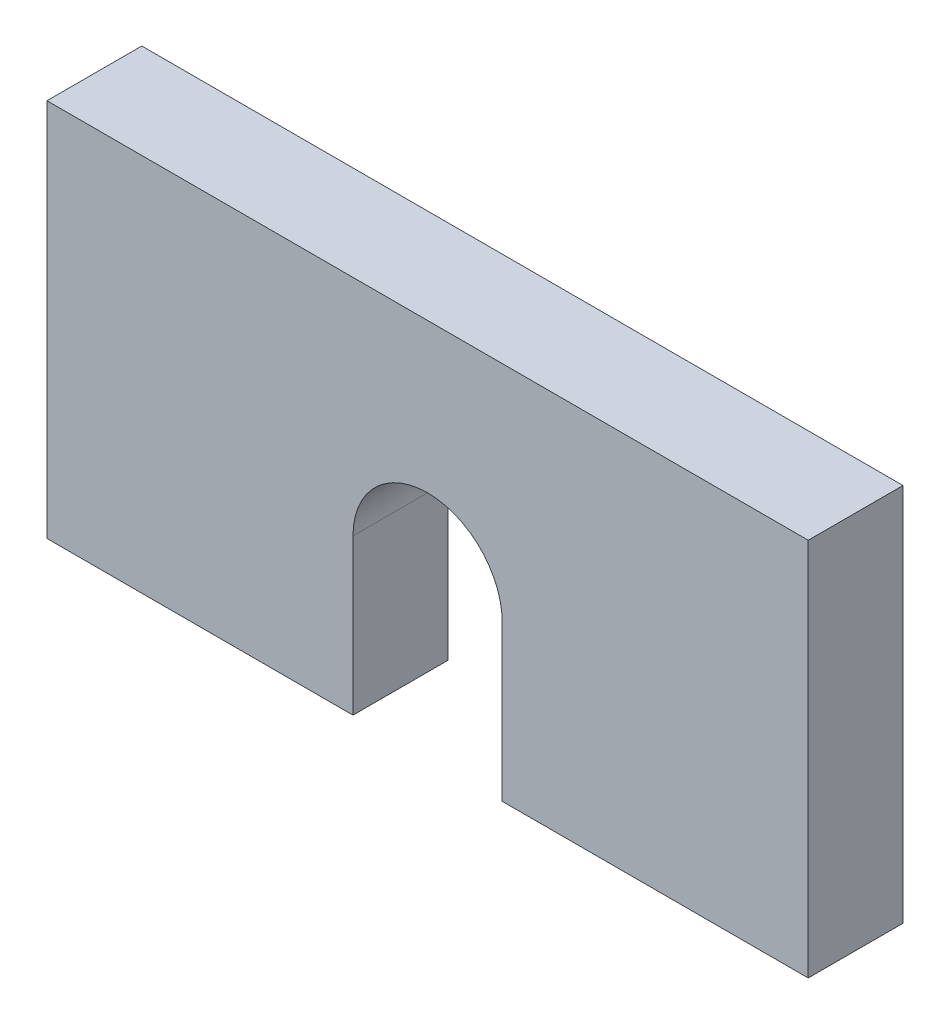
ISO-10303-21;
HEADER;
FILE_DESCRIPTION(('STEP AP214'),'2;1');
FILE_NAME('part.step','',(''),(''),'','','');
FILE_SCHEMA(('AUTOMOTIVE_DESIGN { 1 0 10303 214 1 1 1 1 }'));
ENDSEC;
DATA;
#1=APPLICATION_CONTEXT('core data for automotive mechanical design processes');
#2=APPLICATION_PROTOCOL_DEFINITION('international standard','automotive_design',2000,#1);
#3=PRODUCT_CONTEXT('',#1,'mechanical');
#4=PRODUCT('Part','Part','',(#3));
#5=PRODUCT_RELATED_PRODUCT_CATEGORY('part','',(#4));
#6=PRODUCT_DEFINITION_FORMATION('','',#4);
#7=PRODUCT_DEFINITION_CONTEXT('part definition',#1,'design');
#8=PRODUCT_DEFINITION('design','',#6,#7);
#9=PRODUCT_DEFINITION_SHAPE('','',#8);
#10=(LENGTH_UNIT() NAMED_UNIT(*) SI_UNIT(.MILLI.,.METRE.));
#11=(NAMED_UNIT(*) PLANE_ANGLE_UNIT() SI_UNIT($,.RADIAN.));
#12=(NAMED_UNIT(*) SI_UNIT($,.STERADIAN.) SOLID_ANGLE_UNIT());
#13=UNCERTAINTY_MEASURE_WITH_UNIT(LENGTH_MEASURE(1.E-05),#10,'distance_accuracy_value','');
#14=(GEOMETRIC_REPRESENTATION_CONTEXT(3) GLOBAL_UNCERTAINTY_ASSIGNED_CONTEXT((#13)) GLOBAL_UNIT_ASSIGNED_CONTEXT((#10,
#11,#12)) REPRESENTATION_CONTEXT('',''));
#15=CARTESIAN_POINT('',(0.,0.,0.));
#16=DIRECTION('',(0.,0.,1.));
#17=DIRECTION('',(1.,0.,0.));
#18=AXIS2_PLACEMENT_3D('',#15,#16,#17);
#19=CARTESIAN_POINT('',(-25.5,15.,6.35));
#20=DIRECTION('',(1.,0.,0.));
#21=DIRECTION('',(0.,1.,0.));
#22=AXIS2_PLACEMENT_3D('',#19,#20,#21);
#23=PLANE('',#22);
#24=DIRECTION('',(0.,-1.,0.));
#25=VECTOR('',#24,1.);
#26=CARTESIAN_POINT('',(-25.5,15.,0.));
#27=LINE('',#26,#25);
#28=CARTESIAN_POINT('',(-25.5,15.,0.));
#29=VERTEX_POINT('',#28);
#30=CARTESIAN_POINT('',(-25.5,-10.4,0.));
#31=VERTEX_POINT('',#30);
#32=EDGE_CURVE('E148',#29,#31,#27,.T.);
#33=ORIENTED_EDGE('',*,*,#32,.T.);
#34=DIRECTION('',(0.,0.,-1.));
#35=VECTOR('',#34,1.);
#36=CARTESIAN_POINT('',(-25.5,-10.4,6.35));
#37=LINE('',#36,#35);
#38=CARTESIAN_POINT('',(-25.5,-10.4,6.35));
#39=VERTEX_POINT('',#38);
#40=EDGE_CURVE('E11',#39,#31,#37,.T.);
#41=ORIENTED_EDGE('',*,*,#40,.F.);
#42=DIRECTION('',(0.,-1.,0.));
#43=VECTOR('',#42,1.);
#44=CARTESIAN_POINT('',(-25.5,15.,6.35));
#45=LINE('',#44,#43);
#46=CARTESIAN_POINT('',(-25.5,15.,6.35));
#47=VERTEX_POINT('',#46);
#48=EDGE_CURVE('E170',#47,#39,#45,.T.);
#49=ORIENTED_EDGE('',*,*,#48,.F.);
#50=DIRECTION('',(0.,0.,-1.));
#51=VECTOR('',#50,1.);
#52=CARTESIAN_POINT('',(-25.5,15.,6.35));
#53=LINE('',#52,#51);
#54=EDGE_CURVE('E144',#47,#29,#53,.T.);
#55=ORIENTED_EDGE('',*,*,#54,.T.);
#56=EDGE_LOOP('',(#33,#41,#49,#55));
#57=FACE_BOUND('',#56,.T.);
#58=ADVANCED_FACE('F47',(#57),#23,.F.);
#59=CARTESIAN_POINT('',(-25.5,-10.4,6.35));
#60=DIRECTION('',(0.,1.,0.));
#61=DIRECTION('',(-1.,0.,0.));
#62=AXIS2_PLACEMENT_3D('',#59,#60,#61);
#63=PLANE('',#62);
#64=DIRECTION('',(1.,0.,0.));
#65=VECTOR('',#64,1.);
#66=CARTESIAN_POINT('',(-25.5,-10.4,0.));
#67=LINE('',#66,#65);
#68=CARTESIAN_POINT('',(-5.,-10.4,0.));
#69=VERTEX_POINT('',#68);
#70=EDGE_CURVE('E152',#31,#69,#67,.T.);
#71=ORIENTED_EDGE('',*,*,#70,.T.);
#72=DIRECTION('',(0.,0.,-1.));
#73=VECTOR('',#72,1.);
#74=CARTESIAN_POINT('',(-5.,-10.4,6.35));
#75=LINE('',#74,#73);
#76=CARTESIAN_POINT('',(-5.,-10.4,6.35));
#77=VERTEX_POINT('',#76);
#78=EDGE_CURVE('E56',#77,#69,#75,.T.);
#79=ORIENTED_EDGE('',*,*,#78,.F.);
#80=DIRECTION('',(1.,0.,0.));
#81=VECTOR('',#80,1.);
#82=CARTESIAN_POINT('',(-25.5,-10.4,6.35));
#83=LINE('',#82,#81);
#84=EDGE_CURVE('E107',#39,#77,#83,.T.);
#85=ORIENTED_EDGE('',*,*,#84,.F.);
#86=ORIENTED_EDGE('',*,*,#40,.T.);
#87=EDGE_LOOP('',(#71,#79,#85,#86));
#88=FACE_BOUND('',#87,.T.);
#89=ADVANCED_FACE('F216',(#88),#63,.F.);
#90=CARTESIAN_POINT('',(-5.,0.,6.35));
#91=DIRECTION('',(-1.,0.,0.));
#92=DIRECTION('',(0.,-1.,0.));
#93=AXIS2_PLACEMENT_3D('',#90,#91,#92);
#94=PLANE('',#93);
#95=DIRECTION('',(0.,1.,0.));
#96=VECTOR('',#95,1.);
#97=CARTESIAN_POINT('',(-5.,0.,0.));
#98=LINE('',#97,#96);
#99=CARTESIAN_POINT('',(-5.,0.,0.));
#100=VERTEX_POINT('',#99);
#101=EDGE_CURVE('E155',#69,#100,#98,.T.);
#102=ORIENTED_EDGE('',*,*,#101,.T.);
#103=DIRECTION('',(0.,0.,-1.));
#104=VECTOR('',#103,1.);
#105=CARTESIAN_POINT('',(-5.,0.,6.35));
#106=LINE('',#105,#104);
#107=CARTESIAN_POINT('',(-5.,0.,6.35));
#108=VERTEX_POINT('',#107);
#109=EDGE_CURVE('E181',#108,#100,#106,.T.);
#110=ORIENTED_EDGE('',*,*,#109,.F.);
#111=DIRECTION('',(0.,1.,0.));
#112=VECTOR('',#111,1.);
#113=CARTESIAN_POINT('',(-5.,0.,6.35));
#114=LINE('',#113,#112);
#115=EDGE_CURVE('E191',#77,#108,#114,.T.);
#116=ORIENTED_EDGE('',*,*,#115,.F.);
#117=ORIENTED_EDGE('',*,*,#78,.T.);
#118=EDGE_LOOP('',(#102,#110,#116,#117));
#119=FACE_BOUND('',#118,.T.);
#120=ADVANCED_FACE('F189',(#119),#94,.F.);
#121=CARTESIAN_POINT('',(0.,0.,6.35));
#122=DIRECTION('',(0.,0.,-1.));
#123=DIRECTION('',(-1.,0.,0.));
#124=AXIS2_PLACEMENT_3D('',#121,#122,#123);
#125=CYLINDRICAL_SURFACE('',#124,5.);
#126=CARTESIAN_POINT('',(0.,0.,0.));
#127=DIRECTION('',(0.,0.,-1.));
#128=DIRECTION('',(1.,0.,0.));
#129=AXIS2_PLACEMENT_3D('',#126,#127,#128);
#130=CIRCLE('',#129,5.);
#131=CARTESIAN_POINT('',(5.,0.,0.));
#132=VERTEX_POINT('',#131);
#133=EDGE_CURVE('E158',#100,#132,#130,.T.);
#134=ORIENTED_EDGE('',*,*,#133,.T.);
#135=DIRECTION('',(0.,0.,-1.));
#136=VECTOR('',#135,1.);
#137=CARTESIAN_POINT('',(5.,0.,6.35));
#138=LINE('',#137,#136);
#139=CARTESIAN_POINT('',(5.,0.,6.35));
#140=VERTEX_POINT('',#139);
#141=EDGE_CURVE('E177',#140,#132,#138,.T.);
#142=ORIENTED_EDGE('',*,*,#141,.F.);
#143=CARTESIAN_POINT('',(0.,0.,6.35));
#144=DIRECTION('',(0.,0.,-1.));
#145=DIRECTION('',(1.,0.,0.));
#146=AXIS2_PLACEMENT_3D('',#143,#144,#145);
#147=CIRCLE('',#146,5.);
#148=EDGE_CURVE('E204',#108,#140,#147,.T.);
#149=ORIENTED_EDGE('',*,*,#148,.F.);
#150=ORIENTED_EDGE('',*,*,#109,.T.);
#151=EDGE_LOOP('',(#134,#142,#149,#150));
#152=FACE_BOUND('',#151,.T.);
#153=ADVANCED_FACE('F199',(#152),#125,.F.);
#154=CARTESIAN_POINT('',(5.,0.,6.35));
#155=DIRECTION('',(1.,0.,0.));
#156=DIRECTION('',(0.,1.,0.));
#157=AXIS2_PLACEMENT_3D('',#154,#155,#156);
#158=PLANE('',#157);
#159=DIRECTION('',(0.,-1.,0.));
#160=VECTOR('',#159,1.);
#161=CARTESIAN_POINT('',(5.,0.,0.));
#162=LINE('',#161,#160);
#163=CARTESIAN_POINT('',(5.,-10.4,0.));
#164=VERTEX_POINT('',#163);
#165=EDGE_CURVE('E161',#132,#164,#162,.T.);
#166=ORIENTED_EDGE('',*,*,#165,.T.);
#167=DIRECTION('',(0.,0.,-1.));
#168=VECTOR('',#167,1.);
#169=CARTESIAN_POINT('',(5.,-10.4,6.35));
#170=LINE('',#169,#168);
#171=CARTESIAN_POINT('',(5.,-10.4,6.35));
#172=VERTEX_POINT('',#171);
#173=EDGE_CURVE('E137',#172,#164,#170,.T.);
#174=ORIENTED_EDGE('',*,*,#173,.F.);
#175=DIRECTION('',(0.,-1.,0.));
#176=VECTOR('',#175,1.);
#177=CARTESIAN_POINT('',(5.,0.,6.35));
#178=LINE('',#177,#176);
#179=EDGE_CURVE('E126',#140,#172,#178,.T.);
#180=ORIENTED_EDGE('',*,*,#179,.F.);
#181=ORIENTED_EDGE('',*,*,#141,.T.);
#182=EDGE_LOOP('',(#166,#174,#180,#181));
#183=FACE_BOUND('',#182,.T.);
#184=ADVANCED_FACE('F202',(#183),#158,.F.);
#185=CARTESIAN_POINT('',(5.,-10.4,6.35));
#186=DIRECTION('',(0.,1.,0.));
#187=DIRECTION('',(-1.,0.,0.));
#188=AXIS2_PLACEMENT_3D('',#185,#186,#187);
#189=PLANE('',#188);
#190=DIRECTION('',(1.,0.,0.));
#191=VECTOR('',#190,1.);
#192=CARTESIAN_POINT('',(5.,-10.4,0.));
#193=LINE('',#192,#191);
#194=CARTESIAN_POINT('',(25.5,-10.4,0.));
#195=VERTEX_POINT('',#194);
#196=EDGE_CURVE('E135',#164,#195,#193,.T.);
#197=ORIENTED_EDGE('',*,*,#196,.T.);
#198=DIRECTION('',(0.,0.,-1.));
#199=VECTOR('',#198,1.);
#200=CARTESIAN_POINT('',(25.5,-10.4,6.35));
#201=LINE('',#200,#199);
#202=CARTESIAN_POINT('',(25.5,-10.4,6.35));
#203=VERTEX_POINT('',#202);
#204=EDGE_CURVE('E132',#203,#195,#201,.T.);
#205=ORIENTED_EDGE('',*,*,#204,.F.);
#206=DIRECTION('',(1.,0.,0.));
#207=VECTOR('',#206,1.);
#208=CARTESIAN_POINT('',(5.,-10.4,6.35));
#209=LINE('',#208,#207);
#210=EDGE_CURVE('E120',#172,#203,#209,.T.);
#211=ORIENTED_EDGE('',*,*,#210,.F.);
#212=ORIENTED_EDGE('',*,*,#173,.T.);
#213=EDGE_LOOP('',(#197,#205,#211,#212));
#214=FACE_BOUND('',#213,.T.);
#215=ADVANCED_FACE('F133',(#214),#189,.F.);
#216=CARTESIAN_POINT('',(25.5,15.,6.35));
#217=DIRECTION('',(-1.,0.,0.));
#218=DIRECTION('',(0.,-1.,0.));
#219=AXIS2_PLACEMENT_3D('',#216,#217,#218);
#220=PLANE('',#219);
#221=DIRECTION('',(0.,1.,0.));
#222=VECTOR('',#221,1.);
#223=CARTESIAN_POINT('',(25.5,15.,0.));
#224=LINE('',#223,#222);
#225=CARTESIAN_POINT('',(25.5,15.,0.));
#226=VERTEX_POINT('',#225);
#227=EDGE_CURVE('E93',#195,#226,#224,.T.);
#228=ORIENTED_EDGE('',*,*,#227,.T.);
#229=DIRECTION('',(0.,0.,-1.));
#230=VECTOR('',#229,1.);
#231=CARTESIAN_POINT('',(25.5,15.,6.35));
#232=LINE('',#231,#230);
#233=CARTESIAN_POINT('',(25.5,15.,6.35));
#234=VERTEX_POINT('',#233);
#235=EDGE_CURVE('E138',#234,#226,#232,.T.);
#236=ORIENTED_EDGE('',*,*,#235,.F.);
#237=DIRECTION('',(0.,1.,0.));
#238=VECTOR('',#237,1.);
#239=CARTESIAN_POINT('',(25.5,15.,6.35));
#240=LINE('',#239,#238);
#241=EDGE_CURVE('E124',#203,#234,#240,.T.);
#242=ORIENTED_EDGE('',*,*,#241,.F.);
#243=ORIENTED_EDGE('',*,*,#204,.T.);
#244=EDGE_LOOP('',(#228,#236,#242,#243));
#245=FACE_BOUND('',#244,.T.);
#246=ADVANCED_FACE('F140',(#245),#220,.F.);
#247=CARTESIAN_POINT('',(-25.5,15.,6.35));
#248=DIRECTION('',(0.,-1.,0.));
#249=DIRECTION('',(0.,0.,-1.));
#250=AXIS2_PLACEMENT_3D('',#247,#248,#249);
#251=PLANE('',#250);
#252=DIRECTION('',(-1.,0.,0.));
#253=VECTOR('',#252,1.);
#254=CARTESIAN_POINT('',(-25.5,15.,0.));
#255=LINE('',#254,#253);
#256=EDGE_CURVE('E99',#226,#29,#255,.T.);
#257=ORIENTED_EDGE('',*,*,#256,.T.);
#258=ORIENTED_EDGE('',*,*,#54,.F.);
#259=DIRECTION('',(-1.,0.,0.));
#260=VECTOR('',#259,1.);
#261=CARTESIAN_POINT('',(-25.5,15.,6.35));
#262=LINE('',#261,#260);
#263=EDGE_CURVE('E64',#234,#47,#262,.T.);
#264=ORIENTED_EDGE('',*,*,#263,.F.);
#265=ORIENTED_EDGE('',*,*,#235,.T.);
#266=EDGE_LOOP('',(#257,#258,#264,#265));
#267=FACE_BOUND('',#266,.T.);
#268=ADVANCED_FACE('F232',(#267),#251,.F.);
#269=CARTESIAN_POINT('',(0.,0.,6.35));
#270=DIRECTION('',(0.,0.,1.));
#271=DIRECTION('',(1.,0.,0.));
#272=AXIS2_PLACEMENT_3D('',#269,#270,#271);
#273=PLANE('',#272);
#274=ORIENTED_EDGE('',*,*,#48,.T.);
#275=ORIENTED_EDGE('',*,*,#84,.T.);
#276=ORIENTED_EDGE('',*,*,#115,.T.);
#277=ORIENTED_EDGE('',*,*,#148,.T.);
#278=ORIENTED_EDGE('',*,*,#179,.T.);
#279=ORIENTED_EDGE('',*,*,#210,.T.);
#280=ORIENTED_EDGE('',*,*,#241,.T.);
#281=ORIENTED_EDGE('',*,*,#263,.T.);
#282=EDGE_LOOP('',(#274,#275,#276,#277,#278,#279,#280,#281));
#283=FACE_BOUND('',#282,.T.);
#284=ADVANCED_FACE('F122',(#283),#273,.T.);
#285=CARTESIAN_POINT('',(0.,0.,0.));
#286=DIRECTION('',(0.,0.,1.));
#287=DIRECTION('',(1.,0.,0.));
#288=AXIS2_PLACEMENT_3D('',#285,#286,#287);
#289=PLANE('',#288);
#290=ORIENTED_EDGE('',*,*,#32,.F.);
#291=ORIENTED_EDGE('',*,*,#256,.F.);
#292=ORIENTED_EDGE('',*,*,#227,.F.);
#293=ORIENTED_EDGE('',*,*,#196,.F.);
#294=ORIENTED_EDGE('',*,*,#165,.F.);
#295=ORIENTED_EDGE('',*,*,#133,.F.);
#296=ORIENTED_EDGE('',*,*,#101,.F.);
#297=ORIENTED_EDGE('',*,*,#70,.F.);
#298=EDGE_LOOP('',(#290,#291,#292,#293,#294,#295,#296,#297));
#299=FACE_BOUND('',#298,.T.);
#300=ADVANCED_FACE('F195',(#299),#289,.F.);
#301=CLOSED_SHELL('',(#58,#89,#120,#153,#184,#215,#246,#268,#284,#300));
#302=MANIFOLD_SOLID_BREP('B2',#301);
#303=ADVANCED_BREP_SHAPE_REPRESENTATION('',(#18,#302),#14);
#304=SHAPE_DEFINITION_REPRESENTATION(#9,#303);
ENDSEC;
END-ISO-10303-21;
